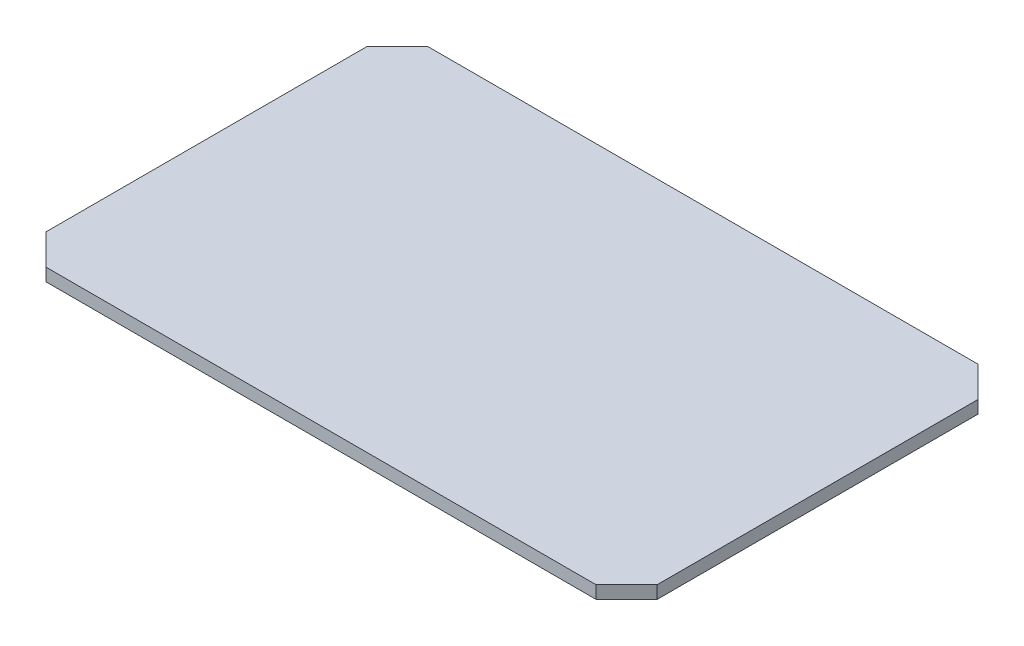
ISO-10303-21;
HEADER;
FILE_DESCRIPTION(('STEP AP214'),'2;1');
FILE_NAME('part.step','',(''),(''),'','','');
FILE_SCHEMA(('AUTOMOTIVE_DESIGN { 1 0 10303 214 1 1 1 1 }'));
ENDSEC;
DATA;
#1=APPLICATION_CONTEXT('core data for automotive mechanical design processes');
#2=APPLICATION_PROTOCOL_DEFINITION('international standard','automotive_design',2000,#1);
#3=PRODUCT_CONTEXT('',#1,'mechanical');
#4=PRODUCT('Part','Part','',(#3));
#5=PRODUCT_RELATED_PRODUCT_CATEGORY('part','',(#4));
#6=PRODUCT_DEFINITION_FORMATION('','',#4);
#7=PRODUCT_DEFINITION_CONTEXT('part definition',#1,'design');
#8=PRODUCT_DEFINITION('design','',#6,#7);
#9=PRODUCT_DEFINITION_SHAPE('','',#8);
#10=(LENGTH_UNIT() NAMED_UNIT(*) SI_UNIT(.MILLI.,.METRE.));
#11=(NAMED_UNIT(*) PLANE_ANGLE_UNIT() SI_UNIT($,.RADIAN.));
#12=(NAMED_UNIT(*) SI_UNIT($,.STERADIAN.) SOLID_ANGLE_UNIT());
#13=UNCERTAINTY_MEASURE_WITH_UNIT(LENGTH_MEASURE(1.E-05),#10,'distance_accuracy_value','');
#14=(GEOMETRIC_REPRESENTATION_CONTEXT(3) GLOBAL_UNCERTAINTY_ASSIGNED_CONTEXT((#13)) GLOBAL_UNIT_ASSIGNED_CONTEXT((#10,
#11,#12)) REPRESENTATION_CONTEXT('',''));
#15=CARTESIAN_POINT('',(0.,0.,0.));
#16=DIRECTION('',(0.,0.,1.));
#17=DIRECTION('',(1.,0.,0.));
#18=AXIS2_PLACEMENT_3D('',#15,#16,#17);
#19=CARTESIAN_POINT('',(-2.4,0.1,-1.5));
#20=DIRECTION('',(1.,0.,0.));
#21=DIRECTION('',(0.,0.,-1.));
#22=AXIS2_PLACEMENT_3D('',#19,#20,#21);
#23=PLANE('',#22);
#24=DIRECTION('',(0.,0.,1.));
#25=VECTOR('',#24,1.);
#26=CARTESIAN_POINT('',(-2.4,0.1,-1.5));
#27=LINE('',#26,#25);
#28=CARTESIAN_POINT('',(-2.4,0.1,-1.26));
#29=VERTEX_POINT('',#28);
#30=CARTESIAN_POINT('',(-2.4,0.1,1.26));
#31=VERTEX_POINT('',#30);
#32=EDGE_CURVE('E122',#29,#31,#27,.T.);
#33=ORIENTED_EDGE('',*,*,#32,.F.);
#34=DIRECTION('',(0.,-1.,0.));
#35=VECTOR('',#34,1.);
#36=CARTESIAN_POINT('',(-2.4,0.1,-1.26));
#37=LINE('',#36,#35);
#38=CARTESIAN_POINT('',(-2.4,0.,-1.26));
#39=VERTEX_POINT('',#38);
#40=EDGE_CURVE('E150',#29,#39,#37,.T.);
#41=ORIENTED_EDGE('',*,*,#40,.T.);
#42=DIRECTION('',(0.,0.,1.));
#43=VECTOR('',#42,1.);
#44=CARTESIAN_POINT('',(-2.4,0.,-1.5));
#45=LINE('',#44,#43);
#46=CARTESIAN_POINT('',(-2.4,0.,1.26));
#47=VERTEX_POINT('',#46);
#48=EDGE_CURVE('E124',#39,#47,#45,.T.);
#49=ORIENTED_EDGE('',*,*,#48,.T.);
#50=DIRECTION('',(0.,1.,0.));
#51=VECTOR('',#50,1.);
#52=CARTESIAN_POINT('',(-2.4,0.1,1.26));
#53=LINE('',#52,#51);
#54=EDGE_CURVE('E137',#47,#31,#53,.T.);
#55=ORIENTED_EDGE('',*,*,#54,.T.);
#56=EDGE_LOOP('',(#33,#41,#49,#55));
#57=FACE_BOUND('',#56,.T.);
#58=ADVANCED_FACE('F31',(#57),#23,.F.);
#59=CARTESIAN_POINT('',(-2.4,0.1,1.5));
#60=DIRECTION('',(0.,0.,-1.));
#61=DIRECTION('',(-1.,0.,0.));
#62=AXIS2_PLACEMENT_3D('',#59,#60,#61);
#63=PLANE('',#62);
#64=DIRECTION('',(1.,0.,0.));
#65=VECTOR('',#64,1.);
#66=CARTESIAN_POINT('',(-2.4,0.1,1.5));
#67=LINE('',#66,#65);
#68=CARTESIAN_POINT('',(-2.16,0.1,1.5));
#69=VERTEX_POINT('',#68);
#70=CARTESIAN_POINT('',(2.16,0.1,1.5));
#71=VERTEX_POINT('',#70);
#72=EDGE_CURVE('E162',#69,#71,#67,.T.);
#73=ORIENTED_EDGE('',*,*,#72,.F.);
#74=DIRECTION('',(0.,-1.,0.));
#75=VECTOR('',#74,1.);
#76=CARTESIAN_POINT('',(-2.16,0.1,1.5));
#77=LINE('',#76,#75);
#78=CARTESIAN_POINT('',(-2.16,0.,1.5));
#79=VERTEX_POINT('',#78);
#80=EDGE_CURVE('E131',#69,#79,#77,.T.);
#81=ORIENTED_EDGE('',*,*,#80,.T.);
#82=DIRECTION('',(1.,0.,0.));
#83=VECTOR('',#82,1.);
#84=CARTESIAN_POINT('',(-2.4,0.,1.5));
#85=LINE('',#84,#83);
#86=CARTESIAN_POINT('',(2.16,0.,1.5));
#87=VERTEX_POINT('',#86);
#88=EDGE_CURVE('E120',#79,#87,#85,.T.);
#89=ORIENTED_EDGE('',*,*,#88,.T.);
#90=DIRECTION('',(0.,1.,0.));
#91=VECTOR('',#90,1.);
#92=CARTESIAN_POINT('',(2.16,0.1,1.5));
#93=LINE('',#92,#91);
#94=EDGE_CURVE('E103',#87,#71,#93,.T.);
#95=ORIENTED_EDGE('',*,*,#94,.T.);
#96=EDGE_LOOP('',(#73,#81,#89,#95));
#97=FACE_BOUND('',#96,.T.);
#98=ADVANCED_FACE('F172',(#97),#63,.F.);
#99=CARTESIAN_POINT('',(2.4,0.1,-1.5));
#100=DIRECTION('',(-1.,0.,0.));
#101=DIRECTION('',(0.,0.,1.));
#102=AXIS2_PLACEMENT_3D('',#99,#100,#101);
#103=PLANE('',#102);
#104=DIRECTION('',(0.,0.,-1.));
#105=VECTOR('',#104,1.);
#106=CARTESIAN_POINT('',(2.4,0.,-1.5));
#107=LINE('',#106,#105);
#108=CARTESIAN_POINT('',(2.4,0.,1.26));
#109=VERTEX_POINT('',#108);
#110=CARTESIAN_POINT('',(2.4,0.,-1.26));
#111=VERTEX_POINT('',#110);
#112=EDGE_CURVE('E111',#109,#111,#107,.T.);
#113=ORIENTED_EDGE('',*,*,#112,.T.);
#114=DIRECTION('',(0.,1.,0.));
#115=VECTOR('',#114,1.);
#116=CARTESIAN_POINT('',(2.4,0.1,-1.26));
#117=LINE('',#116,#115);
#118=CARTESIAN_POINT('',(2.4,0.1,-1.26));
#119=VERTEX_POINT('',#118);
#120=EDGE_CURVE('E146',#111,#119,#117,.T.);
#121=ORIENTED_EDGE('',*,*,#120,.T.);
#122=DIRECTION('',(0.,0.,-1.));
#123=VECTOR('',#122,1.);
#124=CARTESIAN_POINT('',(2.4,0.1,-1.5));
#125=LINE('',#124,#123);
#126=CARTESIAN_POINT('',(2.4,0.1,1.26));
#127=VERTEX_POINT('',#126);
#128=EDGE_CURVE('E114',#127,#119,#125,.T.);
#129=ORIENTED_EDGE('',*,*,#128,.F.);
#130=DIRECTION('',(0.,-1.,0.));
#131=VECTOR('',#130,1.);
#132=CARTESIAN_POINT('',(2.4,0.1,1.26));
#133=LINE('',#132,#131);
#134=EDGE_CURVE('E101',#127,#109,#133,.T.);
#135=ORIENTED_EDGE('',*,*,#134,.T.);
#136=EDGE_LOOP('',(#113,#121,#129,#135));
#137=FACE_BOUND('',#136,.T.);
#138=ADVANCED_FACE('F110',(#137),#103,.F.);
#139=CARTESIAN_POINT('',(-2.4,0.1,-1.5));
#140=DIRECTION('',(0.,0.,1.));
#141=DIRECTION('',(1.,0.,0.));
#142=AXIS2_PLACEMENT_3D('',#139,#140,#141);
#143=PLANE('',#142);
#144=DIRECTION('',(-1.,0.,0.));
#145=VECTOR('',#144,1.);
#146=CARTESIAN_POINT('',(-2.4,0.,-1.5));
#147=LINE('',#146,#145);
#148=CARTESIAN_POINT('',(2.16,0.,-1.5));
#149=VERTEX_POINT('',#148);
#150=CARTESIAN_POINT('',(-2.16,0.,-1.5));
#151=VERTEX_POINT('',#150);
#152=EDGE_CURVE('E119',#149,#151,#147,.T.);
#153=ORIENTED_EDGE('',*,*,#152,.T.);
#154=DIRECTION('',(0.,1.,0.));
#155=VECTOR('',#154,1.);
#156=CARTESIAN_POINT('',(-2.16,0.1,-1.5));
#157=LINE('',#156,#155);
#158=CARTESIAN_POINT('',(-2.16,0.1,-1.5));
#159=VERTEX_POINT('',#158);
#160=EDGE_CURVE('E39',#151,#159,#157,.T.);
#161=ORIENTED_EDGE('',*,*,#160,.T.);
#162=DIRECTION('',(-1.,0.,0.));
#163=VECTOR('',#162,1.);
#164=CARTESIAN_POINT('',(-2.4,0.1,-1.5));
#165=LINE('',#164,#163);
#166=CARTESIAN_POINT('',(2.16,0.1,-1.5));
#167=VERTEX_POINT('',#166);
#168=EDGE_CURVE('E115',#167,#159,#165,.T.);
#169=ORIENTED_EDGE('',*,*,#168,.F.);
#170=DIRECTION('',(0.,-1.,0.));
#171=VECTOR('',#170,1.);
#172=CARTESIAN_POINT('',(2.16,0.1,-1.5));
#173=LINE('',#172,#171);
#174=EDGE_CURVE('E142',#167,#149,#173,.T.);
#175=ORIENTED_EDGE('',*,*,#174,.T.);
#176=EDGE_LOOP('',(#153,#161,#169,#175));
#177=FACE_BOUND('',#176,.T.);
#178=ADVANCED_FACE('F177',(#177),#143,.F.);
#179=CARTESIAN_POINT('',(-2.4,0.1,1.5));
#180=DIRECTION('',(0.,1.,0.));
#181=DIRECTION('',(0.,0.,1.));
#182=AXIS2_PLACEMENT_3D('',#179,#180,#181);
#183=PLANE('',#182);
#184=ORIENTED_EDGE('',*,*,#168,.T.);
#185=DIRECTION('',(0.707106781186548,0.,-0.707106781186548));
#186=VECTOR('',#185,1.);
#187=CARTESIAN_POINT('',(-3.78,0.1,0.12));
#188=LINE('',#187,#186);
#189=EDGE_CURVE('E11',#159,#29,#188,.F.);
#190=ORIENTED_EDGE('',*,*,#189,.T.);
#191=ORIENTED_EDGE('',*,*,#32,.T.);
#192=DIRECTION('',(-0.707106781186546,0.,-0.707106781186549));
#193=VECTOR('',#192,1.);
#194=CARTESIAN_POINT('',(-2.28,0.1,1.38));
#195=LINE('',#194,#193);
#196=EDGE_CURVE('E140',#31,#69,#195,.F.);
#197=ORIENTED_EDGE('',*,*,#196,.T.);
#198=ORIENTED_EDGE('',*,*,#72,.T.);
#199=DIRECTION('',(-0.707106781186548,0.,0.707106781186547));
#200=VECTOR('',#199,1.);
#201=CARTESIAN_POINT('',(-0.120000000000003,0.1,3.78));
#202=LINE('',#201,#200);
#203=EDGE_CURVE('E129',#71,#127,#202,.F.);
#204=ORIENTED_EDGE('',*,*,#203,.T.);
#205=ORIENTED_EDGE('',*,*,#128,.T.);
#206=DIRECTION('',(0.707106781186546,0.,0.707106781186549));
#207=VECTOR('',#206,1.);
#208=CARTESIAN_POINT('',(1.38000000000001,0.1,-2.27999999999999));
#209=LINE('',#208,#207);
#210=EDGE_CURVE('E148',#119,#167,#209,.F.);
#211=ORIENTED_EDGE('',*,*,#210,.T.);
#212=EDGE_LOOP('',(#184,#190,#191,#197,#198,#204,#205,#211));
#213=FACE_BOUND('',#212,.T.);
#214=ADVANCED_FACE('F165',(#213),#183,.T.);
#215=CARTESIAN_POINT('',(-2.4,0.,1.5));
#216=DIRECTION('',(0.,1.,0.));
#217=DIRECTION('',(0.,0.,1.));
#218=AXIS2_PLACEMENT_3D('',#215,#216,#217);
#219=PLANE('',#218);
#220=ORIENTED_EDGE('',*,*,#48,.F.);
#221=DIRECTION('',(-0.707106781186548,0.,0.707106781186548));
#222=VECTOR('',#221,1.);
#223=CARTESIAN_POINT('',(-2.4,0.,-1.26));
#224=LINE('',#223,#222);
#225=EDGE_CURVE('E53',#39,#151,#224,.F.);
#226=ORIENTED_EDGE('',*,*,#225,.T.);
#227=ORIENTED_EDGE('',*,*,#152,.F.);
#228=DIRECTION('',(-0.707106781186546,0.,-0.707106781186549));
#229=VECTOR('',#228,1.);
#230=CARTESIAN_POINT('',(2.16,0.,-1.5));
#231=LINE('',#230,#229);
#232=EDGE_CURVE('E118',#149,#111,#231,.F.);
#233=ORIENTED_EDGE('',*,*,#232,.T.);
#234=ORIENTED_EDGE('',*,*,#112,.F.);
#235=DIRECTION('',(0.707106781186548,0.,-0.707106781186547));
#236=VECTOR('',#235,1.);
#237=CARTESIAN_POINT('',(2.4,0.,1.26));
#238=LINE('',#237,#236);
#239=EDGE_CURVE('E97',#109,#87,#238,.F.);
#240=ORIENTED_EDGE('',*,*,#239,.T.);
#241=ORIENTED_EDGE('',*,*,#88,.F.);
#242=DIRECTION('',(0.707106781186546,0.,0.707106781186549));
#243=VECTOR('',#242,1.);
#244=CARTESIAN_POINT('',(-2.16,0.,1.5));
#245=LINE('',#244,#243);
#246=EDGE_CURVE('E134',#79,#47,#245,.F.);
#247=ORIENTED_EDGE('',*,*,#246,.T.);
#248=EDGE_LOOP('',(#220,#226,#227,#233,#234,#240,#241,#247));
#249=FACE_BOUND('',#248,.T.);
#250=ADVANCED_FACE('F117',(#249),#219,.F.);
#251=CARTESIAN_POINT('',(2.4,0.1,1.26));
#252=DIRECTION('',(-0.707106781186547,0.,-0.707106781186548));
#253=DIRECTION('',(-0.707106781186548,0.,0.707106781186547));
#254=AXIS2_PLACEMENT_3D('',#251,#252,#253);
#255=PLANE('',#254);
#256=ORIENTED_EDGE('',*,*,#203,.F.);
#257=ORIENTED_EDGE('',*,*,#94,.F.);
#258=ORIENTED_EDGE('',*,*,#239,.F.);
#259=ORIENTED_EDGE('',*,*,#134,.F.);
#260=EDGE_LOOP('',(#256,#257,#258,#259));
#261=FACE_BOUND('',#260,.T.);
#262=ADVANCED_FACE('F100',(#261),#255,.F.);
#263=CARTESIAN_POINT('',(-2.16,0.1,1.5));
#264=DIRECTION('',(0.707106781186549,0.,-0.707106781186546));
#265=DIRECTION('',(-0.707106781186546,0.,-0.707106781186549));
#266=AXIS2_PLACEMENT_3D('',#263,#264,#265);
#267=PLANE('',#266);
#268=ORIENTED_EDGE('',*,*,#196,.F.);
#269=ORIENTED_EDGE('',*,*,#54,.F.);
#270=ORIENTED_EDGE('',*,*,#246,.F.);
#271=ORIENTED_EDGE('',*,*,#80,.F.);
#272=EDGE_LOOP('',(#268,#269,#270,#271));
#273=FACE_BOUND('',#272,.T.);
#274=ADVANCED_FACE('F170',(#273),#267,.F.);
#275=CARTESIAN_POINT('',(2.16,0.1,-1.5));
#276=DIRECTION('',(-0.707106781186549,0.,0.707106781186546));
#277=DIRECTION('',(0.707106781186546,0.,0.707106781186549));
#278=AXIS2_PLACEMENT_3D('',#275,#276,#277);
#279=PLANE('',#278);
#280=ORIENTED_EDGE('',*,*,#210,.F.);
#281=ORIENTED_EDGE('',*,*,#120,.F.);
#282=ORIENTED_EDGE('',*,*,#232,.F.);
#283=ORIENTED_EDGE('',*,*,#174,.F.);
#284=EDGE_LOOP('',(#280,#281,#282,#283));
#285=FACE_BOUND('',#284,.T.);
#286=ADVANCED_FACE('F176',(#285),#279,.F.);
#287=CARTESIAN_POINT('',(-2.4,0.1,-1.26));
#288=DIRECTION('',(0.707106781186548,0.,0.707106781186548));
#289=DIRECTION('',(0.707106781186548,0.,-0.707106781186548));
#290=AXIS2_PLACEMENT_3D('',#287,#288,#289);
#291=PLANE('',#290);
#292=ORIENTED_EDGE('',*,*,#189,.F.);
#293=ORIENTED_EDGE('',*,*,#160,.F.);
#294=ORIENTED_EDGE('',*,*,#225,.F.);
#295=ORIENTED_EDGE('',*,*,#40,.F.);
#296=EDGE_LOOP('',(#292,#293,#294,#295));
#297=FACE_BOUND('',#296,.T.);
#298=ADVANCED_FACE('F33',(#297),#291,.F.);
#299=CLOSED_SHELL('',(#58,#98,#138,#178,#214,#250,#262,#274,#286,#298));
#300=MANIFOLD_SOLID_BREP('B2',#299);
#301=ADVANCED_BREP_SHAPE_REPRESENTATION('',(#18,#300),#14);
#302=SHAPE_DEFINITION_REPRESENTATION(#9,#301);
ENDSEC;
END-ISO-10303-21;
